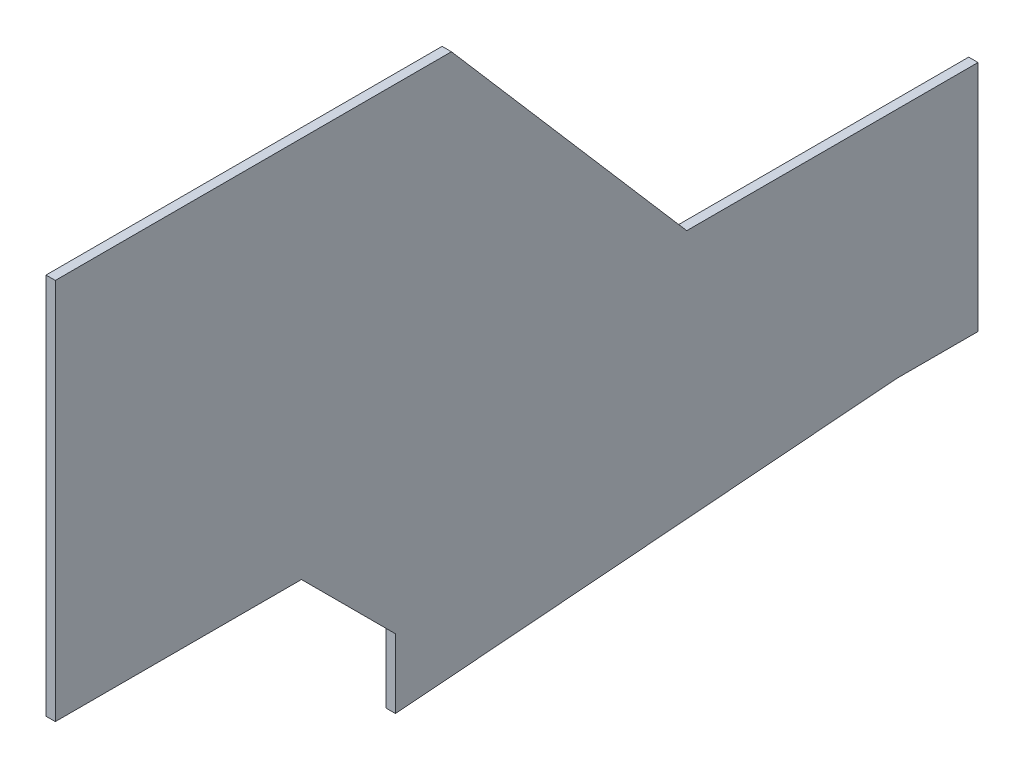
ISO-10303-21;
HEADER;
FILE_DESCRIPTION(('STEP AP214'),'2;1');
FILE_NAME('part.step','',(''),(''),'','','');
FILE_SCHEMA(('AUTOMOTIVE_DESIGN { 1 0 10303 214 1 1 1 1 }'));
ENDSEC;
DATA;
#1=APPLICATION_CONTEXT('core data for automotive mechanical design processes');
#2=APPLICATION_PROTOCOL_DEFINITION('international standard','automotive_design',2000,#1);
#3=PRODUCT_CONTEXT('',#1,'mechanical');
#4=PRODUCT('Part','Part','',(#3));
#5=PRODUCT_RELATED_PRODUCT_CATEGORY('part','',(#4));
#6=PRODUCT_DEFINITION_FORMATION('','',#4);
#7=PRODUCT_DEFINITION_CONTEXT('part definition',#1,'design');
#8=PRODUCT_DEFINITION('design','',#6,#7);
#9=PRODUCT_DEFINITION_SHAPE('','',#8);
#10=(LENGTH_UNIT() NAMED_UNIT(*) SI_UNIT(.MILLI.,.METRE.));
#11=(NAMED_UNIT(*) PLANE_ANGLE_UNIT() SI_UNIT($,.RADIAN.));
#12=(NAMED_UNIT(*) SI_UNIT($,.STERADIAN.) SOLID_ANGLE_UNIT());
#13=UNCERTAINTY_MEASURE_WITH_UNIT(LENGTH_MEASURE(1.E-05),#10,'distance_accuracy_value','');
#14=(GEOMETRIC_REPRESENTATION_CONTEXT(3) GLOBAL_UNCERTAINTY_ASSIGNED_CONTEXT((#13)) GLOBAL_UNIT_ASSIGNED_CONTEXT((#10,
#11,#12)) REPRESENTATION_CONTEXT('',''));
#15=CARTESIAN_POINT('',(0.,0.,0.));
#16=DIRECTION('',(0.,0.,1.));
#17=DIRECTION('',(1.,0.,0.));
#18=AXIS2_PLACEMENT_3D('',#15,#16,#17);
#19=CARTESIAN_POINT('',(4.,89.,196.));
#20=DIRECTION('',(0.,0.,-1.));
#21=DIRECTION('',(0.,1.,0.));
#22=AXIS2_PLACEMENT_3D('',#19,#20,#21);
#23=PLANE('',#22);
#24=DIRECTION('',(0.,-1.,0.));
#25=VECTOR('',#24,1.);
#26=CARTESIAN_POINT('',(0.,89.,196.));
#27=LINE('',#26,#25);
#28=CARTESIAN_POINT('',(0.,89.,196.));
#29=VERTEX_POINT('',#28);
#30=CARTESIAN_POINT('',(0.,-75.,196.));
#31=VERTEX_POINT('',#30);
#32=EDGE_CURVE('E147',#29,#31,#27,.T.);
#33=ORIENTED_EDGE('',*,*,#32,.T.);
#34=DIRECTION('',(-1.,0.,0.));
#35=VECTOR('',#34,1.);
#36=CARTESIAN_POINT('',(4.,-75.,196.));
#37=LINE('',#36,#35);
#38=CARTESIAN_POINT('',(4.,-75.,196.));
#39=VERTEX_POINT('',#38);
#40=EDGE_CURVE('E11',#39,#31,#37,.T.);
#41=ORIENTED_EDGE('',*,*,#40,.F.);
#42=DIRECTION('',(0.,-1.,0.));
#43=VECTOR('',#42,1.);
#44=CARTESIAN_POINT('',(4.,89.,196.));
#45=LINE('',#44,#43);
#46=CARTESIAN_POINT('',(4.,89.,196.));
#47=VERTEX_POINT('',#46);
#48=EDGE_CURVE('E165',#47,#39,#45,.T.);
#49=ORIENTED_EDGE('',*,*,#48,.F.);
#50=DIRECTION('',(-1.,0.,0.));
#51=VECTOR('',#50,1.);
#52=CARTESIAN_POINT('',(4.,89.,196.));
#53=LINE('',#52,#51);
#54=EDGE_CURVE('E143',#47,#29,#53,.T.);
#55=ORIENTED_EDGE('',*,*,#54,.T.);
#56=EDGE_LOOP('',(#33,#41,#49,#55));
#57=FACE_BOUND('',#56,.T.);
#58=ADVANCED_FACE('F39',(#57),#23,.F.);
#59=CARTESIAN_POINT('',(4.,-75.,196.));
#60=DIRECTION('',(0.,1.,0.));
#61=DIRECTION('',(0.,0.,1.));
#62=AXIS2_PLACEMENT_3D('',#59,#60,#61);
#63=PLANE('',#62);
#64=DIRECTION('',(0.,0.,-1.));
#65=VECTOR('',#64,1.);
#66=CARTESIAN_POINT('',(0.,-75.,196.));
#67=LINE('',#66,#65);
#68=CARTESIAN_POINT('',(0.,-75.,90.3534188971469));
#69=VERTEX_POINT('',#68);
#70=EDGE_CURVE('E150',#31,#69,#67,.T.);
#71=ORIENTED_EDGE('',*,*,#70,.T.);
#72=DIRECTION('',(-1.,0.,0.));
#73=VECTOR('',#72,1.);
#74=CARTESIAN_POINT('',(4.,-75.,90.3534188971469));
#75=LINE('',#74,#73);
#76=CARTESIAN_POINT('',(4.,-75.,90.3534188971469));
#77=VERTEX_POINT('',#76);
#78=EDGE_CURVE('E47',#77,#69,#75,.T.);
#79=ORIENTED_EDGE('',*,*,#78,.F.);
#80=DIRECTION('',(0.,0.,-1.));
#81=VECTOR('',#80,1.);
#82=CARTESIAN_POINT('',(4.,-75.,196.));
#83=LINE('',#82,#81);
#84=EDGE_CURVE('E104',#39,#77,#83,.T.);
#85=ORIENTED_EDGE('',*,*,#84,.F.);
#86=ORIENTED_EDGE('',*,*,#40,.T.);
#87=EDGE_LOOP('',(#71,#79,#85,#86));
#88=FACE_BOUND('',#87,.T.);
#89=ADVANCED_FACE('F214',(#88),#63,.F.);
#90=CARTESIAN_POINT('',(4.,-75.,90.3534188971469));
#91=DIRECTION('',(0.,0.707106781186546,-0.707106781186549));
#92=DIRECTION('',(0.,0.707106781186549,0.707106781186546));
#93=AXIS2_PLACEMENT_3D('',#90,#91,#92);
#94=PLANE('',#93);
#95=DIRECTION('',(0.,-0.707106781186549,-0.707106781186546));
#96=VECTOR('',#95,1.);
#97=CARTESIAN_POINT('',(0.,-75.,90.3534188971469));
#98=LINE('',#97,#96);
#99=CARTESIAN_POINT('',(0.,-115.353418897147,50.));
#100=VERTEX_POINT('',#99);
#101=EDGE_CURVE('E152',#69,#100,#98,.T.);
#102=ORIENTED_EDGE('',*,*,#101,.T.);
#103=DIRECTION('',(-1.,0.,0.));
#104=VECTOR('',#103,1.);
#105=CARTESIAN_POINT('',(4.,-115.353418897147,50.));
#106=LINE('',#105,#104);
#107=CARTESIAN_POINT('',(4.,-115.353418897147,50.));
#108=VERTEX_POINT('',#107);
#109=EDGE_CURVE('E178',#108,#100,#106,.T.);
#110=ORIENTED_EDGE('',*,*,#109,.F.);
#111=DIRECTION('',(0.,-0.707106781186549,-0.707106781186546));
#112=VECTOR('',#111,1.);
#113=CARTESIAN_POINT('',(4.,-75.,90.3534188971469));
#114=LINE('',#113,#112);
#115=EDGE_CURVE('E186',#77,#108,#114,.T.);
#116=ORIENTED_EDGE('',*,*,#115,.F.);
#117=ORIENTED_EDGE('',*,*,#78,.T.);
#118=EDGE_LOOP('',(#102,#110,#116,#117));
#119=FACE_BOUND('',#118,.T.);
#120=ADVANCED_FACE('F184',(#119),#94,.F.);
#121=CARTESIAN_POINT('',(4.,-115.353418897147,50.));
#122=DIRECTION('',(0.,0.,-1.));
#123=DIRECTION('',(0.,1.,0.));
#124=AXIS2_PLACEMENT_3D('',#121,#122,#123);
#125=PLANE('',#124);
#126=DIRECTION('',(0.,-1.,0.));
#127=VECTOR('',#126,1.);
#128=CARTESIAN_POINT('',(0.,-115.353418897147,50.));
#129=LINE('',#128,#127);
#130=CARTESIAN_POINT('',(0.,-145.,50.));
#131=VERTEX_POINT('',#130);
#132=EDGE_CURVE('E154',#100,#131,#129,.T.);
#133=ORIENTED_EDGE('',*,*,#132,.T.);
#134=DIRECTION('',(-1.,0.,0.));
#135=VECTOR('',#134,1.);
#136=CARTESIAN_POINT('',(4.,-145.,50.));
#137=LINE('',#136,#135);
#138=CARTESIAN_POINT('',(4.,-145.,50.));
#139=VERTEX_POINT('',#138);
#140=EDGE_CURVE('E175',#139,#131,#137,.T.);
#141=ORIENTED_EDGE('',*,*,#140,.F.);
#142=DIRECTION('',(0.,-1.,0.));
#143=VECTOR('',#142,1.);
#144=CARTESIAN_POINT('',(4.,-115.353418897147,50.));
#145=LINE('',#144,#143);
#146=EDGE_CURVE('E204',#108,#139,#145,.T.);
#147=ORIENTED_EDGE('',*,*,#146,.F.);
#148=ORIENTED_EDGE('',*,*,#109,.T.);
#149=EDGE_LOOP('',(#133,#141,#147,#148));
#150=FACE_BOUND('',#149,.T.);
#151=ADVANCED_FACE('F195',(#150),#125,.F.);
#152=CARTESIAN_POINT('',(4.,-145.,50.));
#153=DIRECTION('',(0.,0.996888567931411,0.0788237472317858));
#154=DIRECTION('',(0.,-0.0788237472317858,0.996888567931411));
#155=AXIS2_PLACEMENT_3D('',#152,#153,#154);
#156=PLANE('',#155);
#157=DIRECTION('',(0.,0.0788237472317858,-0.996888567931411));
#158=VECTOR('',#157,1.);
#159=CARTESIAN_POINT('',(0.,-145.,50.));
#160=LINE('',#159,#158);
#161=CARTESIAN_POINT('',(0.,-128.,-165.));
#162=VERTEX_POINT('',#161);
#163=EDGE_CURVE('E156',#131,#162,#160,.T.);
#164=ORIENTED_EDGE('',*,*,#163,.T.);
#165=DIRECTION('',(-1.,0.,0.));
#166=VECTOR('',#165,1.);
#167=CARTESIAN_POINT('',(4.,-128.,-165.));
#168=LINE('',#167,#166);
#169=CARTESIAN_POINT('',(4.,-128.,-165.));
#170=VERTEX_POINT('',#169);
#171=EDGE_CURVE('E172',#170,#162,#168,.T.);
#172=ORIENTED_EDGE('',*,*,#171,.F.);
#173=DIRECTION('',(0.,0.0788237472317858,-0.996888567931411));
#174=VECTOR('',#173,1.);
#175=CARTESIAN_POINT('',(4.,-145.,50.));
#176=LINE('',#175,#174);
#177=EDGE_CURVE('E201',#139,#170,#176,.T.);
#178=ORIENTED_EDGE('',*,*,#177,.F.);
#179=ORIENTED_EDGE('',*,*,#140,.T.);
#180=EDGE_LOOP('',(#164,#172,#178,#179));
#181=FACE_BOUND('',#180,.T.);
#182=ADVANCED_FACE('F199',(#181),#156,.F.);
#183=CARTESIAN_POINT('',(4.,-128.,-165.));
#184=DIRECTION('',(0.,1.,0.));
#185=DIRECTION('',(0.,0.,1.));
#186=AXIS2_PLACEMENT_3D('',#183,#184,#185);
#187=PLANE('',#186);
#188=DIRECTION('',(0.,0.,-1.));
#189=VECTOR('',#188,1.);
#190=CARTESIAN_POINT('',(0.,-128.,-165.));
#191=LINE('',#190,#189);
#192=CARTESIAN_POINT('',(0.,-128.,-200.));
#193=VERTEX_POINT('',#192);
#194=EDGE_CURVE('E158',#162,#193,#191,.T.);
#195=ORIENTED_EDGE('',*,*,#194,.T.);
#196=DIRECTION('',(-1.,0.,0.));
#197=VECTOR('',#196,1.);
#198=CARTESIAN_POINT('',(4.,-128.,-200.));
#199=LINE('',#198,#197);
#200=CARTESIAN_POINT('',(4.,-128.,-200.));
#201=VERTEX_POINT('',#200);
#202=EDGE_CURVE('E169',#201,#193,#199,.T.);
#203=ORIENTED_EDGE('',*,*,#202,.F.);
#204=DIRECTION('',(0.,0.,-1.));
#205=VECTOR('',#204,1.);
#206=CARTESIAN_POINT('',(4.,-128.,-165.));
#207=LINE('',#206,#205);
#208=EDGE_CURVE('E203',#170,#201,#207,.T.);
#209=ORIENTED_EDGE('',*,*,#208,.F.);
#210=ORIENTED_EDGE('',*,*,#171,.T.);
#211=EDGE_LOOP('',(#195,#203,#209,#210));
#212=FACE_BOUND('',#211,.T.);
#213=ADVANCED_FACE('F226',(#212),#187,.F.);
#214=CARTESIAN_POINT('',(4.,-128.,-200.));
#215=DIRECTION('',(0.,0.,1.));
#216=DIRECTION('',(1.,0.,0.));
#217=AXIS2_PLACEMENT_3D('',#214,#215,#216);
#218=PLANE('',#217);
#219=DIRECTION('',(0.,1.,0.));
#220=VECTOR('',#219,1.);
#221=CARTESIAN_POINT('',(0.,-128.,-200.));
#222=LINE('',#221,#220);
#223=CARTESIAN_POINT('',(0.,-28.,-200.));
#224=VERTEX_POINT('',#223);
#225=EDGE_CURVE('E160',#193,#224,#222,.T.);
#226=ORIENTED_EDGE('',*,*,#225,.T.);
#227=DIRECTION('',(-1.,0.,0.));
#228=VECTOR('',#227,1.);
#229=CARTESIAN_POINT('',(4.,-28.,-200.));
#230=LINE('',#229,#228);
#231=CARTESIAN_POINT('',(4.,-28.,-200.));
#232=VERTEX_POINT('',#231);
#233=EDGE_CURVE('E138',#232,#224,#230,.T.);
#234=ORIENTED_EDGE('',*,*,#233,.F.);
#235=DIRECTION('',(0.,1.,0.));
#236=VECTOR('',#235,1.);
#237=CARTESIAN_POINT('',(4.,-128.,-200.));
#238=LINE('',#237,#236);
#239=EDGE_CURVE('E129',#201,#232,#238,.T.);
#240=ORIENTED_EDGE('',*,*,#239,.F.);
#241=ORIENTED_EDGE('',*,*,#202,.T.);
#242=EDGE_LOOP('',(#226,#234,#240,#241));
#243=FACE_BOUND('',#242,.T.);
#244=ADVANCED_FACE('F229',(#243),#218,.F.);
#245=CARTESIAN_POINT('',(4.,-28.,-200.));
#246=DIRECTION('',(0.,-1.,0.));
#247=DIRECTION('',(0.,0.,-1.));
#248=AXIS2_PLACEMENT_3D('',#245,#246,#247);
#249=PLANE('',#248);
#250=DIRECTION('',(0.,0.,1.));
#251=VECTOR('',#250,1.);
#252=CARTESIAN_POINT('',(0.,-28.,-200.));
#253=LINE('',#252,#251);
#254=CARTESIAN_POINT('',(0.,-28.0000000000001,-75.));
#255=VERTEX_POINT('',#254);
#256=EDGE_CURVE('E137',#224,#255,#253,.T.);
#257=ORIENTED_EDGE('',*,*,#256,.T.);
#258=DIRECTION('',(-1.,0.,0.));
#259=VECTOR('',#258,1.);
#260=CARTESIAN_POINT('',(4.,-28.0000000000001,-75.));
#261=LINE('',#260,#259);
#262=CARTESIAN_POINT('',(4.,-28.0000000000001,-75.));
#263=VERTEX_POINT('',#262);
#264=EDGE_CURVE('E134',#263,#255,#261,.T.);
#265=ORIENTED_EDGE('',*,*,#264,.F.);
#266=DIRECTION('',(0.,0.,1.));
#267=VECTOR('',#266,1.);
#268=CARTESIAN_POINT('',(4.,-28.,-200.));
#269=LINE('',#268,#267);
#270=EDGE_CURVE('E123',#232,#263,#269,.T.);
#271=ORIENTED_EDGE('',*,*,#270,.F.);
#272=ORIENTED_EDGE('',*,*,#233,.T.);
#273=EDGE_LOOP('',(#257,#265,#271,#272));
#274=FACE_BOUND('',#273,.T.);
#275=ADVANCED_FACE('F135',(#274),#249,.F.);
#276=CARTESIAN_POINT('',(4.,-28.0000000000001,-75.));
#277=DIRECTION('',(0.,-0.653451409245135,0.756968464175059));
#278=DIRECTION('',(0.,-0.756968464175059,-0.653451409245135));
#279=AXIS2_PLACEMENT_3D('',#276,#277,#278);
#280=PLANE('',#279);
#281=DIRECTION('',(0.,0.756968464175059,0.653451409245135));
#282=VECTOR('',#281,1.);
#283=CARTESIAN_POINT('',(0.,-28.0000000000001,-75.));
#284=LINE('',#283,#282);
#285=CARTESIAN_POINT('',(0.,89.,25.9999999999999));
#286=VERTEX_POINT('',#285);
#287=EDGE_CURVE('E90',#255,#286,#284,.T.);
#288=ORIENTED_EDGE('',*,*,#287,.T.);
#289=DIRECTION('',(-1.,0.,0.));
#290=VECTOR('',#289,1.);
#291=CARTESIAN_POINT('',(4.,89.,25.9999999999999));
#292=LINE('',#291,#290);
#293=CARTESIAN_POINT('',(4.,89.,25.9999999999999));
#294=VERTEX_POINT('',#293);
#295=EDGE_CURVE('E139',#294,#286,#292,.T.);
#296=ORIENTED_EDGE('',*,*,#295,.F.);
#297=DIRECTION('',(0.,0.756968464175059,0.653451409245135));
#298=VECTOR('',#297,1.);
#299=CARTESIAN_POINT('',(4.,-28.0000000000001,-75.));
#300=LINE('',#299,#298);
#301=EDGE_CURVE('E127',#263,#294,#300,.T.);
#302=ORIENTED_EDGE('',*,*,#301,.F.);
#303=ORIENTED_EDGE('',*,*,#264,.T.);
#304=EDGE_LOOP('',(#288,#296,#302,#303));
#305=FACE_BOUND('',#304,.T.);
#306=ADVANCED_FACE('F141',(#305),#280,.F.);
#307=CARTESIAN_POINT('',(4.,89.,25.9999999999999));
#308=DIRECTION('',(0.,-1.,0.));
#309=DIRECTION('',(0.,0.,-1.));
#310=AXIS2_PLACEMENT_3D('',#307,#308,#309);
#311=PLANE('',#310);
#312=DIRECTION('',(0.,0.,1.));
#313=VECTOR('',#312,1.);
#314=CARTESIAN_POINT('',(0.,89.,25.9999999999999));
#315=LINE('',#314,#313);
#316=EDGE_CURVE('E96',#286,#29,#315,.T.);
#317=ORIENTED_EDGE('',*,*,#316,.T.);
#318=ORIENTED_EDGE('',*,*,#54,.F.);
#319=DIRECTION('',(0.,0.,1.));
#320=VECTOR('',#319,1.);
#321=CARTESIAN_POINT('',(4.,89.,25.9999999999999));
#322=LINE('',#321,#320);
#323=EDGE_CURVE('E55',#294,#47,#322,.T.);
#324=ORIENTED_EDGE('',*,*,#323,.F.);
#325=ORIENTED_EDGE('',*,*,#295,.T.);
#326=EDGE_LOOP('',(#317,#318,#324,#325));
#327=FACE_BOUND('',#326,.T.);
#328=ADVANCED_FACE('F238',(#327),#311,.F.);
#329=CARTESIAN_POINT('',(4.,0.,0.));
#330=DIRECTION('',(1.,0.,0.));
#331=DIRECTION('',(0.,0.,-1.));
#332=AXIS2_PLACEMENT_3D('',#329,#330,#331);
#333=PLANE('',#332);
#334=ORIENTED_EDGE('',*,*,#48,.T.);
#335=ORIENTED_EDGE('',*,*,#84,.T.);
#336=ORIENTED_EDGE('',*,*,#115,.T.);
#337=ORIENTED_EDGE('',*,*,#146,.T.);
#338=ORIENTED_EDGE('',*,*,#177,.T.);
#339=ORIENTED_EDGE('',*,*,#208,.T.);
#340=ORIENTED_EDGE('',*,*,#239,.T.);
#341=ORIENTED_EDGE('',*,*,#270,.T.);
#342=ORIENTED_EDGE('',*,*,#301,.T.);
#343=ORIENTED_EDGE('',*,*,#323,.T.);
#344=EDGE_LOOP('',(#334,#335,#336,#337,#338,#339,#340,#341,#342,#343));
#345=FACE_BOUND('',#344,.T.);
#346=ADVANCED_FACE('F125',(#345),#333,.T.);
#347=CARTESIAN_POINT('',(0.,0.,0.));
#348=DIRECTION('',(1.,0.,0.));
#349=DIRECTION('',(0.,0.,-1.));
#350=AXIS2_PLACEMENT_3D('',#347,#348,#349);
#351=PLANE('',#350);
#352=ORIENTED_EDGE('',*,*,#32,.F.);
#353=ORIENTED_EDGE('',*,*,#316,.F.);
#354=ORIENTED_EDGE('',*,*,#287,.F.);
#355=ORIENTED_EDGE('',*,*,#256,.F.);
#356=ORIENTED_EDGE('',*,*,#225,.F.);
#357=ORIENTED_EDGE('',*,*,#194,.F.);
#358=ORIENTED_EDGE('',*,*,#163,.F.);
#359=ORIENTED_EDGE('',*,*,#132,.F.);
#360=ORIENTED_EDGE('',*,*,#101,.F.);
#361=ORIENTED_EDGE('',*,*,#70,.F.);
#362=EDGE_LOOP('',(#352,#353,#354,#355,#356,#357,#358,#359,#360,#361));
#363=FACE_BOUND('',#362,.T.);
#364=ADVANCED_FACE('F190',(#363),#351,.F.);
#365=CLOSED_SHELL('',(#58,#89,#120,#151,#182,#213,#244,#275,#306,#328,#346,#364));
#366=MANIFOLD_SOLID_BREP('B2',#365);
#367=ADVANCED_BREP_SHAPE_REPRESENTATION('',(#18,#366),#14);
#368=SHAPE_DEFINITION_REPRESENTATION(#9,#367);
ENDSEC;
END-ISO-10303-21;
